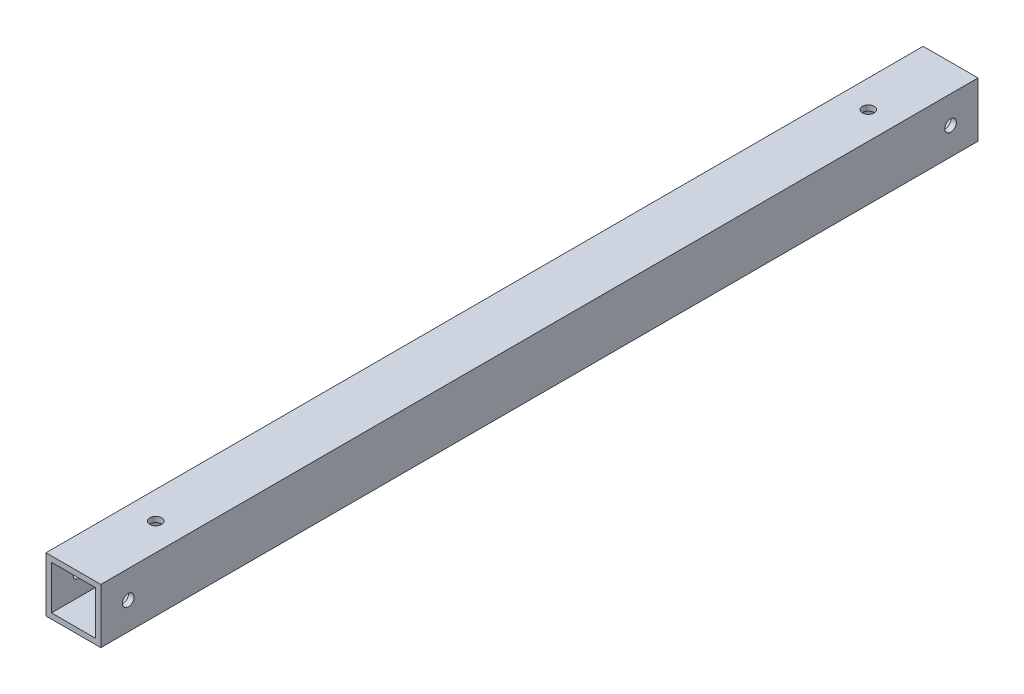
ISO-10303-21;
HEADER;
FILE_DESCRIPTION(('STEP AP214'),'2;1');
FILE_NAME('part.step','',(''),(''),'','','');
FILE_SCHEMA(('AUTOMOTIVE_DESIGN { 1 0 10303 214 1 1 1 1 }'));
ENDSEC;
DATA;
#1=APPLICATION_CONTEXT('core data for automotive mechanical design processes');
#2=APPLICATION_PROTOCOL_DEFINITION('international standard','automotive_design',2000,#1);
#3=PRODUCT_CONTEXT('',#1,'mechanical');
#4=PRODUCT('Part','Part','',(#3));
#5=PRODUCT_RELATED_PRODUCT_CATEGORY('part','',(#4));
#6=PRODUCT_DEFINITION_FORMATION('','',#4);
#7=PRODUCT_DEFINITION_CONTEXT('part definition',#1,'design');
#8=PRODUCT_DEFINITION('design','',#6,#7);
#9=PRODUCT_DEFINITION_SHAPE('','',#8);
#10=(LENGTH_UNIT() NAMED_UNIT(*) SI_UNIT(.MILLI.,.METRE.));
#11=(NAMED_UNIT(*) PLANE_ANGLE_UNIT() SI_UNIT($,.RADIAN.));
#12=(NAMED_UNIT(*) SI_UNIT($,.STERADIAN.) SOLID_ANGLE_UNIT());
#13=UNCERTAINTY_MEASURE_WITH_UNIT(LENGTH_MEASURE(1.E-05),#10,'distance_accuracy_value','');
#14=(GEOMETRIC_REPRESENTATION_CONTEXT(3) GLOBAL_UNCERTAINTY_ASSIGNED_CONTEXT((#13)) GLOBAL_UNIT_ASSIGNED_CONTEXT((#10,
#11,#12)) REPRESENTATION_CONTEXT('',''));
#15=CARTESIAN_POINT('',(0.,0.,0.));
#16=DIRECTION('',(0.,0.,1.));
#17=DIRECTION('',(1.,0.,0.));
#18=AXIS2_PLACEMENT_3D('',#15,#16,#17);
#19=CARTESIAN_POINT('',(0.,0.,240.));
#20=DIRECTION('',(0.,0.,1.));
#21=DIRECTION('',(1.,0.,0.));
#22=AXIS2_PLACEMENT_3D('',#19,#20,#21);
#23=PLANE('',#22);
#24=DIRECTION('',(0.,1.,0.));
#25=VECTOR('',#24,1.);
#26=CARTESIAN_POINT('',(7.5,7.5,240.));
#27=LINE('',#26,#25);
#28=CARTESIAN_POINT('',(7.5,-7.5,240.));
#29=VERTEX_POINT('',#28);
#30=CARTESIAN_POINT('',(7.5,7.5,240.));
#31=VERTEX_POINT('',#30);
#32=EDGE_CURVE('E157',#29,#31,#27,.T.);
#33=ORIENTED_EDGE('',*,*,#32,.T.);
#34=DIRECTION('',(-1.,0.,0.));
#35=VECTOR('',#34,1.);
#36=CARTESIAN_POINT('',(-7.5,7.5,240.));
#37=LINE('',#36,#35);
#38=CARTESIAN_POINT('',(-7.5,7.5,240.));
#39=VERTEX_POINT('',#38);
#40=EDGE_CURVE('E161',#31,#39,#37,.T.);
#41=ORIENTED_EDGE('',*,*,#40,.T.);
#42=DIRECTION('',(0.,-1.,0.));
#43=VECTOR('',#42,1.);
#44=CARTESIAN_POINT('',(-7.5,7.5,240.));
#45=LINE('',#44,#43);
#46=CARTESIAN_POINT('',(-7.5,-7.5,240.));
#47=VERTEX_POINT('',#46);
#48=EDGE_CURVE('E165',#39,#47,#45,.T.);
#49=ORIENTED_EDGE('',*,*,#48,.T.);
#50=DIRECTION('',(1.,0.,0.));
#51=VECTOR('',#50,1.);
#52=CARTESIAN_POINT('',(-7.5,-7.5,240.));
#53=LINE('',#52,#51);
#54=EDGE_CURVE('E168',#47,#29,#53,.T.);
#55=ORIENTED_EDGE('',*,*,#54,.T.);
#56=EDGE_LOOP('',(#33,#41,#49,#55));
#57=FACE_BOUND('',#56,.T.);
#58=DIRECTION('',(1.,0.,0.));
#59=VECTOR('',#58,1.);
#60=CARTESIAN_POINT('',(-6.,-6.,240.));
#61=LINE('',#60,#59);
#62=CARTESIAN_POINT('',(-6.,-6.,240.));
#63=VERTEX_POINT('',#62);
#64=CARTESIAN_POINT('',(6.,-6.,240.));
#65=VERTEX_POINT('',#64);
#66=EDGE_CURVE('E116',#63,#65,#61,.T.);
#67=ORIENTED_EDGE('',*,*,#66,.F.);
#68=DIRECTION('',(0.,-1.,0.));
#69=VECTOR('',#68,1.);
#70=CARTESIAN_POINT('',(-6.,6.,240.));
#71=LINE('',#70,#69);
#72=CARTESIAN_POINT('',(-6.,6.,240.));
#73=VERTEX_POINT('',#72);
#74=EDGE_CURVE('E107',#73,#63,#71,.T.);
#75=ORIENTED_EDGE('',*,*,#74,.F.);
#76=DIRECTION('',(-1.,0.,0.));
#77=VECTOR('',#76,1.);
#78=CARTESIAN_POINT('',(-6.,6.,240.));
#79=LINE('',#78,#77);
#80=CARTESIAN_POINT('',(6.,6.,240.));
#81=VERTEX_POINT('',#80);
#82=EDGE_CURVE('E133',#81,#73,#79,.T.);
#83=ORIENTED_EDGE('',*,*,#82,.F.);
#84=DIRECTION('',(0.,1.,0.));
#85=VECTOR('',#84,1.);
#86=CARTESIAN_POINT('',(6.,6.,240.));
#87=LINE('',#86,#85);
#88=EDGE_CURVE('E129',#65,#81,#87,.T.);
#89=ORIENTED_EDGE('',*,*,#88,.F.);
#90=EDGE_LOOP('',(#67,#75,#83,#89));
#91=FACE_BOUND('',#90,.T.);
#92=ADVANCED_FACE('F39',(#57,#91),#23,.T.);
#93=CARTESIAN_POINT('',(0.,0.,0.));
#94=DIRECTION('',(0.,0.,1.));
#95=DIRECTION('',(1.,0.,0.));
#96=AXIS2_PLACEMENT_3D('',#93,#94,#95);
#97=PLANE('',#96);
#98=DIRECTION('',(0.,1.,0.));
#99=VECTOR('',#98,1.);
#100=CARTESIAN_POINT('',(7.5,7.5,0.));
#101=LINE('',#100,#99);
#102=CARTESIAN_POINT('',(7.5,-7.5,0.));
#103=VERTEX_POINT('',#102);
#104=CARTESIAN_POINT('',(7.5,7.5,0.));
#105=VERTEX_POINT('',#104);
#106=EDGE_CURVE('E125',#103,#105,#101,.T.);
#107=ORIENTED_EDGE('',*,*,#106,.F.);
#108=DIRECTION('',(1.,0.,0.));
#109=VECTOR('',#108,1.);
#110=CARTESIAN_POINT('',(-7.5,-7.5,0.));
#111=LINE('',#110,#109);
#112=CARTESIAN_POINT('',(-7.5,-7.5,0.));
#113=VERTEX_POINT('',#112);
#114=EDGE_CURVE('E162',#113,#103,#111,.T.);
#115=ORIENTED_EDGE('',*,*,#114,.F.);
#116=DIRECTION('',(0.,-1.,0.));
#117=VECTOR('',#116,1.);
#118=CARTESIAN_POINT('',(-7.5,7.5,0.));
#119=LINE('',#118,#117);
#120=CARTESIAN_POINT('',(-7.5,7.5,0.));
#121=VERTEX_POINT('',#120);
#122=EDGE_CURVE('E178',#121,#113,#119,.T.);
#123=ORIENTED_EDGE('',*,*,#122,.F.);
#124=DIRECTION('',(-1.,0.,0.));
#125=VECTOR('',#124,1.);
#126=CARTESIAN_POINT('',(-7.5,7.5,0.));
#127=LINE('',#126,#125);
#128=EDGE_CURVE('E175',#105,#121,#127,.T.);
#129=ORIENTED_EDGE('',*,*,#128,.F.);
#130=EDGE_LOOP('',(#107,#115,#123,#129));
#131=FACE_BOUND('',#130,.T.);
#132=DIRECTION('',(0.,-1.,0.));
#133=VECTOR('',#132,1.);
#134=CARTESIAN_POINT('',(-6.,6.,0.));
#135=LINE('',#134,#133);
#136=CARTESIAN_POINT('',(-6.,6.,0.));
#137=VERTEX_POINT('',#136);
#138=CARTESIAN_POINT('',(-6.,-6.,0.));
#139=VERTEX_POINT('',#138);
#140=EDGE_CURVE('E65',#137,#139,#135,.T.);
#141=ORIENTED_EDGE('',*,*,#140,.T.);
#142=DIRECTION('',(1.,0.,0.));
#143=VECTOR('',#142,1.);
#144=CARTESIAN_POINT('',(-6.,-6.,0.));
#145=LINE('',#144,#143);
#146=CARTESIAN_POINT('',(6.,-6.,0.));
#147=VERTEX_POINT('',#146);
#148=EDGE_CURVE('E123',#139,#147,#145,.T.);
#149=ORIENTED_EDGE('',*,*,#148,.T.);
#150=DIRECTION('',(0.,1.,0.));
#151=VECTOR('',#150,1.);
#152=CARTESIAN_POINT('',(6.,6.,0.));
#153=LINE('',#152,#151);
#154=CARTESIAN_POINT('',(6.,6.,0.));
#155=VERTEX_POINT('',#154);
#156=EDGE_CURVE('E144',#147,#155,#153,.T.);
#157=ORIENTED_EDGE('',*,*,#156,.T.);
#158=DIRECTION('',(-1.,0.,0.));
#159=VECTOR('',#158,1.);
#160=CARTESIAN_POINT('',(-6.,6.,0.));
#161=LINE('',#160,#159);
#162=EDGE_CURVE('E117',#155,#137,#161,.T.);
#163=ORIENTED_EDGE('',*,*,#162,.T.);
#164=EDGE_LOOP('',(#141,#149,#157,#163));
#165=FACE_BOUND('',#164,.T.);
#166=ADVANCED_FACE('F288',(#131,#165),#97,.F.);
#167=CARTESIAN_POINT('',(7.5,7.5,240.));
#168=DIRECTION('',(-1.,0.,0.));
#169=DIRECTION('',(0.,0.,1.));
#170=AXIS2_PLACEMENT_3D('',#167,#168,#169);
#171=PLANE('',#170);
#172=CARTESIAN_POINT('',(7.5,0.,232.5));
#173=DIRECTION('',(1.,0.,0.));
#174=DIRECTION('',(0.,0.,-1.));
#175=AXIS2_PLACEMENT_3D('',#172,#173,#174);
#176=CIRCLE('',#175,1.59999999999999);
#177=CARTESIAN_POINT('',(7.5,0.,230.9));
#178=VERTEX_POINT('',#177);
#179=EDGE_CURVE('E214',#178,#178,#176,.T.);
#180=ORIENTED_EDGE('',*,*,#179,.F.);
#181=EDGE_LOOP('',(#180));
#182=FACE_BOUND('',#181,.T.);
#183=CARTESIAN_POINT('',(7.5,0.,7.5));
#184=DIRECTION('',(1.,0.,0.));
#185=DIRECTION('',(0.,0.,-1.));
#186=AXIS2_PLACEMENT_3D('',#183,#184,#185);
#187=CIRCLE('',#186,1.6);
#188=CARTESIAN_POINT('',(7.5,0.,5.9));
#189=VERTEX_POINT('',#188);
#190=EDGE_CURVE('E226',#189,#189,#187,.T.);
#191=ORIENTED_EDGE('',*,*,#190,.F.);
#192=EDGE_LOOP('',(#191));
#193=FACE_BOUND('',#192,.T.);
#194=ORIENTED_EDGE('',*,*,#106,.T.);
#195=DIRECTION('',(0.,0.,-1.));
#196=VECTOR('',#195,1.);
#197=CARTESIAN_POINT('',(7.5,7.5,240.));
#198=LINE('',#197,#196);
#199=EDGE_CURVE('E11',#31,#105,#198,.T.);
#200=ORIENTED_EDGE('',*,*,#199,.F.);
#201=ORIENTED_EDGE('',*,*,#32,.F.);
#202=DIRECTION('',(0.,0.,-1.));
#203=VECTOR('',#202,1.);
#204=CARTESIAN_POINT('',(7.5,-7.5,240.));
#205=LINE('',#204,#203);
#206=EDGE_CURVE('E171',#29,#103,#205,.T.);
#207=ORIENTED_EDGE('',*,*,#206,.T.);
#208=EDGE_LOOP('',(#194,#200,#201,#207));
#209=FACE_BOUND('',#208,.T.);
#210=ADVANCED_FACE('F41',(#182,#193,#209),#171,.F.);
#211=CARTESIAN_POINT('',(-7.5,7.5,240.));
#212=DIRECTION('',(0.,-1.,0.));
#213=DIRECTION('',(0.,0.,-1.));
#214=AXIS2_PLACEMENT_3D('',#211,#212,#213);
#215=PLANE('',#214);
#216=CARTESIAN_POINT('',(0.,7.5,22.5));
#217=DIRECTION('',(0.,1.,0.));
#218=DIRECTION('',(0.,0.,1.));
#219=AXIS2_PLACEMENT_3D('',#216,#217,#218);
#220=CIRCLE('',#219,1.6);
#221=CARTESIAN_POINT('',(0.,7.5,24.1));
#222=VERTEX_POINT('',#221);
#223=EDGE_CURVE('E238',#222,#222,#220,.T.);
#224=ORIENTED_EDGE('',*,*,#223,.F.);
#225=EDGE_LOOP('',(#224));
#226=FACE_BOUND('',#225,.T.);
#227=CARTESIAN_POINT('',(0.,7.5,217.5));
#228=DIRECTION('',(0.,1.,0.));
#229=DIRECTION('',(0.,0.,1.));
#230=AXIS2_PLACEMENT_3D('',#227,#228,#229);
#231=CIRCLE('',#230,1.59999999999998);
#232=CARTESIAN_POINT('',(0.,7.5,219.1));
#233=VERTEX_POINT('',#232);
#234=EDGE_CURVE('E234',#233,#233,#231,.T.);
#235=ORIENTED_EDGE('',*,*,#234,.F.);
#236=EDGE_LOOP('',(#235));
#237=FACE_BOUND('',#236,.T.);
#238=ORIENTED_EDGE('',*,*,#128,.T.);
#239=DIRECTION('',(0.,0.,-1.));
#240=VECTOR('',#239,1.);
#241=CARTESIAN_POINT('',(-7.5,7.5,240.));
#242=LINE('',#241,#240);
#243=EDGE_CURVE('E49',#39,#121,#242,.T.);
#244=ORIENTED_EDGE('',*,*,#243,.F.);
#245=ORIENTED_EDGE('',*,*,#40,.F.);
#246=ORIENTED_EDGE('',*,*,#199,.T.);
#247=EDGE_LOOP('',(#238,#244,#245,#246));
#248=FACE_BOUND('',#247,.T.);
#249=ADVANCED_FACE('F292',(#226,#237,#248),#215,.F.);
#250=CARTESIAN_POINT('',(-7.5,7.5,240.));
#251=DIRECTION('',(1.,0.,0.));
#252=DIRECTION('',(0.,0.,-1.));
#253=AXIS2_PLACEMENT_3D('',#250,#251,#252);
#254=PLANE('',#253);
#255=CARTESIAN_POINT('',(-7.5,0.,232.5));
#256=DIRECTION('',(1.,0.,0.));
#257=DIRECTION('',(0.,0.,-1.));
#258=AXIS2_PLACEMENT_3D('',#255,#256,#257);
#259=CIRCLE('',#258,1.59999999999999);
#260=CARTESIAN_POINT('',(-7.5,0.,230.9));
#261=VERTEX_POINT('',#260);
#262=EDGE_CURVE('E206',#261,#261,#259,.T.);
#263=ORIENTED_EDGE('',*,*,#262,.T.);
#264=EDGE_LOOP('',(#263));
#265=FACE_BOUND('',#264,.T.);
#266=CARTESIAN_POINT('',(-7.5,0.,7.5));
#267=DIRECTION('',(1.,0.,0.));
#268=DIRECTION('',(0.,0.,-1.));
#269=AXIS2_PLACEMENT_3D('',#266,#267,#268);
#270=CIRCLE('',#269,1.6);
#271=CARTESIAN_POINT('',(-7.5,0.,5.9));
#272=VERTEX_POINT('',#271);
#273=EDGE_CURVE('E220',#272,#272,#270,.T.);
#274=ORIENTED_EDGE('',*,*,#273,.T.);
#275=EDGE_LOOP('',(#274));
#276=FACE_BOUND('',#275,.T.);
#277=ORIENTED_EDGE('',*,*,#122,.T.);
#278=DIRECTION('',(0.,0.,-1.));
#279=VECTOR('',#278,1.);
#280=CARTESIAN_POINT('',(-7.5,-7.5,240.));
#281=LINE('',#280,#279);
#282=EDGE_CURVE('E186',#47,#113,#281,.T.);
#283=ORIENTED_EDGE('',*,*,#282,.F.);
#284=ORIENTED_EDGE('',*,*,#48,.F.);
#285=ORIENTED_EDGE('',*,*,#243,.T.);
#286=EDGE_LOOP('',(#277,#283,#284,#285));
#287=FACE_BOUND('',#286,.T.);
#288=ADVANCED_FACE('F275',(#265,#276,#287),#254,.F.);
#289=CARTESIAN_POINT('',(-7.5,-7.5,240.));
#290=DIRECTION('',(0.,1.,0.));
#291=DIRECTION('',(0.,0.,1.));
#292=AXIS2_PLACEMENT_3D('',#289,#290,#291);
#293=PLANE('',#292);
#294=CARTESIAN_POINT('',(0.,-7.5,22.5));
#295=DIRECTION('',(0.,1.,0.));
#296=DIRECTION('',(0.,0.,1.));
#297=AXIS2_PLACEMENT_3D('',#294,#295,#296);
#298=CIRCLE('',#297,1.6);
#299=CARTESIAN_POINT('',(0.,-7.5,24.1));
#300=VERTEX_POINT('',#299);
#301=EDGE_CURVE('E198',#300,#300,#298,.T.);
#302=ORIENTED_EDGE('',*,*,#301,.T.);
#303=EDGE_LOOP('',(#302));
#304=FACE_BOUND('',#303,.T.);
#305=CARTESIAN_POINT('',(0.,-7.5,217.5));
#306=DIRECTION('',(0.,1.,0.));
#307=DIRECTION('',(0.,0.,1.));
#308=AXIS2_PLACEMENT_3D('',#305,#306,#307);
#309=CIRCLE('',#308,1.59999999999998);
#310=CARTESIAN_POINT('',(0.,-7.5,219.1));
#311=VERTEX_POINT('',#310);
#312=EDGE_CURVE('E242',#311,#311,#309,.T.);
#313=ORIENTED_EDGE('',*,*,#312,.T.);
#314=EDGE_LOOP('',(#313));
#315=FACE_BOUND('',#314,.T.);
#316=ORIENTED_EDGE('',*,*,#114,.T.);
#317=ORIENTED_EDGE('',*,*,#206,.F.);
#318=ORIENTED_EDGE('',*,*,#54,.F.);
#319=ORIENTED_EDGE('',*,*,#282,.T.);
#320=EDGE_LOOP('',(#316,#317,#318,#319));
#321=FACE_BOUND('',#320,.T.);
#322=ADVANCED_FACE('F272',(#304,#315,#321),#293,.F.);
#323=CARTESIAN_POINT('',(-6.,6.,240.));
#324=DIRECTION('',(1.,0.,0.));
#325=DIRECTION('',(0.,1.,0.));
#326=AXIS2_PLACEMENT_3D('',#323,#324,#325);
#327=PLANE('',#326);
#328=CARTESIAN_POINT('',(-6.,0.,232.5));
#329=DIRECTION('',(1.,0.,0.));
#330=DIRECTION('',(0.,1.,0.));
#331=AXIS2_PLACEMENT_3D('',#328,#329,#330);
#332=CIRCLE('',#331,1.59999999999999);
#333=CARTESIAN_POINT('',(-6.,0.,230.9));
#334=VERTEX_POINT('',#333);
#335=EDGE_CURVE('E230',#334,#334,#332,.T.);
#336=ORIENTED_EDGE('',*,*,#335,.F.);
#337=EDGE_LOOP('',(#336));
#338=FACE_BOUND('',#337,.T.);
#339=CARTESIAN_POINT('',(-6.,0.,7.5));
#340=DIRECTION('',(1.,0.,0.));
#341=DIRECTION('',(0.,1.,0.));
#342=AXIS2_PLACEMENT_3D('',#339,#340,#341);
#343=CIRCLE('',#342,1.6);
#344=CARTESIAN_POINT('',(-6.,0.,5.9));
#345=VERTEX_POINT('',#344);
#346=EDGE_CURVE('E205',#345,#345,#343,.T.);
#347=ORIENTED_EDGE('',*,*,#346,.F.);
#348=EDGE_LOOP('',(#347));
#349=FACE_BOUND('',#348,.T.);
#350=ORIENTED_EDGE('',*,*,#140,.F.);
#351=DIRECTION('',(0.,0.,-1.));
#352=VECTOR('',#351,1.);
#353=CARTESIAN_POINT('',(-6.,6.,240.));
#354=LINE('',#353,#352);
#355=EDGE_CURVE('E111',#73,#137,#354,.T.);
#356=ORIENTED_EDGE('',*,*,#355,.F.);
#357=ORIENTED_EDGE('',*,*,#74,.T.);
#358=DIRECTION('',(0.,0.,-1.));
#359=VECTOR('',#358,1.);
#360=CARTESIAN_POINT('',(-6.,-6.,240.));
#361=LINE('',#360,#359);
#362=EDGE_CURVE('E110',#63,#139,#361,.T.);
#363=ORIENTED_EDGE('',*,*,#362,.T.);
#364=EDGE_LOOP('',(#350,#356,#357,#363));
#365=FACE_BOUND('',#364,.T.);
#366=ADVANCED_FACE('F109',(#338,#349,#365),#327,.T.);
#367=CARTESIAN_POINT('',(-6.,-6.,240.));
#368=DIRECTION('',(0.,1.,0.));
#369=DIRECTION('',(0.,0.,1.));
#370=AXIS2_PLACEMENT_3D('',#367,#368,#369);
#371=PLANE('',#370);
#372=CARTESIAN_POINT('',(0.,-6.,22.5));
#373=DIRECTION('',(0.,1.,0.));
#374=DIRECTION('',(0.,0.,1.));
#375=AXIS2_PLACEMENT_3D('',#372,#373,#374);
#376=CIRCLE('',#375,1.6);
#377=CARTESIAN_POINT('',(0.,-6.,24.1));
#378=VERTEX_POINT('',#377);
#379=EDGE_CURVE('E141',#378,#378,#376,.T.);
#380=ORIENTED_EDGE('',*,*,#379,.F.);
#381=EDGE_LOOP('',(#380));
#382=FACE_BOUND('',#381,.T.);
#383=CARTESIAN_POINT('',(0.,-6.,217.5));
#384=DIRECTION('',(0.,1.,0.));
#385=DIRECTION('',(0.,0.,1.));
#386=AXIS2_PLACEMENT_3D('',#383,#384,#385);
#387=CIRCLE('',#386,1.59999999999998);
#388=CARTESIAN_POINT('',(0.,-6.,219.1));
#389=VERTEX_POINT('',#388);
#390=EDGE_CURVE('E197',#389,#389,#387,.T.);
#391=ORIENTED_EDGE('',*,*,#390,.F.);
#392=EDGE_LOOP('',(#391));
#393=FACE_BOUND('',#392,.T.);
#394=ORIENTED_EDGE('',*,*,#148,.F.);
#395=ORIENTED_EDGE('',*,*,#362,.F.);
#396=ORIENTED_EDGE('',*,*,#66,.T.);
#397=DIRECTION('',(0.,0.,-1.));
#398=VECTOR('',#397,1.);
#399=CARTESIAN_POINT('',(6.,-6.,240.));
#400=LINE('',#399,#398);
#401=EDGE_CURVE('E126',#65,#147,#400,.T.);
#402=ORIENTED_EDGE('',*,*,#401,.T.);
#403=EDGE_LOOP('',(#394,#395,#396,#402));
#404=FACE_BOUND('',#403,.T.);
#405=ADVANCED_FACE('F120',(#382,#393,#404),#371,.T.);
#406=CARTESIAN_POINT('',(6.,6.,240.));
#407=DIRECTION('',(-1.,0.,0.));
#408=DIRECTION('',(0.,-1.,0.));
#409=AXIS2_PLACEMENT_3D('',#406,#407,#408);
#410=PLANE('',#409);
#411=CARTESIAN_POINT('',(6.,0.,232.5));
#412=DIRECTION('',(-1.,0.,0.));
#413=DIRECTION('',(0.,-1.,0.));
#414=AXIS2_PLACEMENT_3D('',#411,#412,#413);
#415=CIRCLE('',#414,1.59999999999999);
#416=CARTESIAN_POINT('',(6.,0.,230.9));
#417=VERTEX_POINT('',#416);
#418=EDGE_CURVE('E43',#417,#417,#415,.T.);
#419=ORIENTED_EDGE('',*,*,#418,.F.);
#420=EDGE_LOOP('',(#419));
#421=FACE_BOUND('',#420,.T.);
#422=CARTESIAN_POINT('',(6.,0.,7.5));
#423=DIRECTION('',(-1.,0.,0.));
#424=DIRECTION('',(0.,-1.,0.));
#425=AXIS2_PLACEMENT_3D('',#422,#423,#424);
#426=CIRCLE('',#425,1.6);
#427=CARTESIAN_POINT('',(6.,0.,5.9));
#428=VERTEX_POINT('',#427);
#429=EDGE_CURVE('E202',#428,#428,#426,.T.);
#430=ORIENTED_EDGE('',*,*,#429,.F.);
#431=EDGE_LOOP('',(#430));
#432=FACE_BOUND('',#431,.T.);
#433=ORIENTED_EDGE('',*,*,#156,.F.);
#434=ORIENTED_EDGE('',*,*,#401,.F.);
#435=ORIENTED_EDGE('',*,*,#88,.T.);
#436=DIRECTION('',(0.,0.,-1.));
#437=VECTOR('',#436,1.);
#438=CARTESIAN_POINT('',(6.,6.,240.));
#439=LINE('',#438,#437);
#440=EDGE_CURVE('E57',#81,#155,#439,.T.);
#441=ORIENTED_EDGE('',*,*,#440,.T.);
#442=EDGE_LOOP('',(#433,#434,#435,#441));
#443=FACE_BOUND('',#442,.T.);
#444=ADVANCED_FACE('F260',(#421,#432,#443),#410,.T.);
#445=CARTESIAN_POINT('',(-6.,6.,240.));
#446=DIRECTION('',(0.,-1.,0.));
#447=DIRECTION('',(0.,0.,-1.));
#448=AXIS2_PLACEMENT_3D('',#445,#446,#447);
#449=PLANE('',#448);
#450=CARTESIAN_POINT('',(0.,6.,22.5));
#451=DIRECTION('',(0.,-1.,0.));
#452=DIRECTION('',(0.,0.,-1.));
#453=AXIS2_PLACEMENT_3D('',#450,#451,#452);
#454=CIRCLE('',#453,1.6);
#455=CARTESIAN_POINT('',(0.,6.,20.9));
#456=VERTEX_POINT('',#455);
#457=EDGE_CURVE('E199',#456,#456,#454,.T.);
#458=ORIENTED_EDGE('',*,*,#457,.F.);
#459=EDGE_LOOP('',(#458));
#460=FACE_BOUND('',#459,.T.);
#461=CARTESIAN_POINT('',(0.,6.,217.5));
#462=DIRECTION('',(0.,-1.,0.));
#463=DIRECTION('',(0.,0.,-1.));
#464=AXIS2_PLACEMENT_3D('',#461,#462,#463);
#465=CIRCLE('',#464,1.59999999999998);
#466=CARTESIAN_POINT('',(0.,6.,215.9));
#467=VERTEX_POINT('',#466);
#468=EDGE_CURVE('E193',#467,#467,#465,.T.);
#469=ORIENTED_EDGE('',*,*,#468,.F.);
#470=EDGE_LOOP('',(#469));
#471=FACE_BOUND('',#470,.T.);
#472=ORIENTED_EDGE('',*,*,#162,.F.);
#473=ORIENTED_EDGE('',*,*,#440,.F.);
#474=ORIENTED_EDGE('',*,*,#82,.T.);
#475=ORIENTED_EDGE('',*,*,#355,.T.);
#476=EDGE_LOOP('',(#472,#473,#474,#475));
#477=FACE_BOUND('',#476,.T.);
#478=ADVANCED_FACE('F315',(#460,#471,#477),#449,.T.);
#479=CARTESIAN_POINT('',(0.,-7.5,217.5));
#480=DIRECTION('',(0.,1.,0.));
#481=DIRECTION('',(0.,0.,1.));
#482=AXIS2_PLACEMENT_3D('',#479,#480,#481);
#483=CYLINDRICAL_SURFACE('',#482,1.59999999999998);
#484=ORIENTED_EDGE('',*,*,#468,.T.);
#485=EDGE_LOOP('',(#484));
#486=FACE_BOUND('',#485,.T.);
#487=ORIENTED_EDGE('',*,*,#234,.T.);
#488=EDGE_LOOP('',(#487));
#489=FACE_BOUND('',#488,.T.);
#490=ADVANCED_FACE('F269',(#486,#489),#483,.F.);
#491=CARTESIAN_POINT('',(0.,-7.5,22.5));
#492=DIRECTION('',(0.,1.,0.));
#493=DIRECTION('',(0.,0.,1.));
#494=AXIS2_PLACEMENT_3D('',#491,#492,#493);
#495=CYLINDRICAL_SURFACE('',#494,1.6);
#496=ORIENTED_EDGE('',*,*,#457,.T.);
#497=EDGE_LOOP('',(#496));
#498=FACE_BOUND('',#497,.T.);
#499=ORIENTED_EDGE('',*,*,#223,.T.);
#500=EDGE_LOOP('',(#499));
#501=FACE_BOUND('',#500,.T.);
#502=ADVANCED_FACE('F267',(#498,#501),#495,.F.);
#503=ORIENTED_EDGE('',*,*,#390,.T.);
#504=EDGE_LOOP('',(#503));
#505=FACE_BOUND('',#504,.T.);
#506=ORIENTED_EDGE('',*,*,#312,.F.);
#507=EDGE_LOOP('',(#506));
#508=FACE_BOUND('',#507,.T.);
#509=ADVANCED_FACE('F264',(#505,#508),#483,.F.);
#510=ORIENTED_EDGE('',*,*,#379,.T.);
#511=EDGE_LOOP('',(#510));
#512=FACE_BOUND('',#511,.T.);
#513=ORIENTED_EDGE('',*,*,#301,.F.);
#514=EDGE_LOOP('',(#513));
#515=FACE_BOUND('',#514,.T.);
#516=ADVANCED_FACE('F255',(#512,#515),#495,.F.);
#517=CARTESIAN_POINT('',(-7.5,0.,7.5));
#518=DIRECTION('',(1.,0.,0.));
#519=DIRECTION('',(0.,0.,-1.));
#520=AXIS2_PLACEMENT_3D('',#517,#518,#519);
#521=CYLINDRICAL_SURFACE('',#520,1.6);
#522=CARTESIAN_POINT('',(6.,0.,5.9));
#523=CARTESIAN_POINT('',(6.015625,0.,5.9));
#524=CARTESIAN_POINT('',(6.03125,0.,5.9));
#525=CARTESIAN_POINT('',(6.0625,0.,5.9));
#526=CARTESIAN_POINT('',(6.078125,0.,5.9));
#527=CARTESIAN_POINT('',(6.109375,0.,5.9));
#528=CARTESIAN_POINT('',(6.125,0.,5.9));
#529=CARTESIAN_POINT('',(6.15625,0.,5.9));
#530=CARTESIAN_POINT('',(6.171875,0.,5.9));
#531=CARTESIAN_POINT('',(6.203125,0.,5.9));
#532=CARTESIAN_POINT('',(6.21875,0.,5.9));
#533=CARTESIAN_POINT('',(6.25,0.,5.9));
#534=CARTESIAN_POINT('',(6.265625,0.,5.9));
#535=CARTESIAN_POINT('',(6.296875,0.,5.9));
#536=CARTESIAN_POINT('',(6.3125,0.,5.9));
#537=CARTESIAN_POINT('',(6.34375,0.,5.9));
#538=CARTESIAN_POINT('',(6.359375,0.,5.9));
#539=CARTESIAN_POINT('',(6.390625,0.,5.9));
#540=CARTESIAN_POINT('',(6.40625,0.,5.9));
#541=CARTESIAN_POINT('',(6.4375,0.,5.9));
#542=CARTESIAN_POINT('',(6.453125,0.,5.9));
#543=CARTESIAN_POINT('',(6.484375,0.,5.9));
#544=CARTESIAN_POINT('',(6.5,0.,5.9));
#545=CARTESIAN_POINT('',(6.53125,0.,5.9));
#546=CARTESIAN_POINT('',(6.546875,0.,5.9));
#547=CARTESIAN_POINT('',(6.578125,0.,5.9));
#548=CARTESIAN_POINT('',(6.59375,0.,5.9));
#549=CARTESIAN_POINT('',(6.625,0.,5.9));
#550=CARTESIAN_POINT('',(6.640625,0.,5.9));
#551=CARTESIAN_POINT('',(6.671875,0.,5.9));
#552=CARTESIAN_POINT('',(6.6875,0.,5.9));
#553=CARTESIAN_POINT('',(6.71875,0.,5.9));
#554=CARTESIAN_POINT('',(6.734375,0.,5.9));
#555=CARTESIAN_POINT('',(6.765625,0.,5.9));
#556=CARTESIAN_POINT('',(6.78125,0.,5.9));
#557=CARTESIAN_POINT('',(6.8125,0.,5.9));
#558=CARTESIAN_POINT('',(6.828125,0.,5.9));
#559=CARTESIAN_POINT('',(6.859375,0.,5.9));
#560=CARTESIAN_POINT('',(6.875,0.,5.9));
#561=CARTESIAN_POINT('',(6.90625,0.,5.9));
#562=CARTESIAN_POINT('',(6.921875,0.,5.9));
#563=CARTESIAN_POINT('',(6.953125,0.,5.9));
#564=CARTESIAN_POINT('',(6.96875,0.,5.9));
#565=CARTESIAN_POINT('',(7.,0.,5.9));
#566=CARTESIAN_POINT('',(7.015625,0.,5.9));
#567=CARTESIAN_POINT('',(7.046875,0.,5.9));
#568=CARTESIAN_POINT('',(7.0625,0.,5.9));
#569=CARTESIAN_POINT('',(7.09375,0.,5.9));
#570=CARTESIAN_POINT('',(7.109375,0.,5.9));
#571=CARTESIAN_POINT('',(7.140625,0.,5.9));
#572=CARTESIAN_POINT('',(7.15625,0.,5.9));
#573=CARTESIAN_POINT('',(7.1875,0.,5.9));
#574=CARTESIAN_POINT('',(7.203125,0.,5.9));
#575=CARTESIAN_POINT('',(7.234375,0.,5.9));
#576=CARTESIAN_POINT('',(7.25,0.,5.9));
#577=CARTESIAN_POINT('',(7.28125,0.,5.9));
#578=CARTESIAN_POINT('',(7.296875,0.,5.9));
#579=CARTESIAN_POINT('',(7.328125,0.,5.9));
#580=CARTESIAN_POINT('',(7.34375,0.,5.9));
#581=CARTESIAN_POINT('',(7.375,0.,5.9));
#582=CARTESIAN_POINT('',(7.390625,0.,5.9));
#583=CARTESIAN_POINT('',(7.421875,0.,5.9));
#584=CARTESIAN_POINT('',(7.4375,0.,5.9));
#585=CARTESIAN_POINT('',(7.46875,0.,5.9));
#586=CARTESIAN_POINT('',(7.484375,0.,5.9));
#587=CARTESIAN_POINT('',(7.5,0.,5.9));
#588=B_SPLINE_CURVE_WITH_KNOTS('',3,(#522,#523,#524,#525,#526,#527,#528,#529,#530,#531,#532,
#533,#534,#535,#536,#537,#538,#539,#540,#541,#542,#543,#544,#545,#546,#547,#548,#549,#550,#551,
#552,#553,#554,#555,#556,#557,#558,#559,#560,#561,#562,#563,#564,#565,#566,#567,#568,#569,#570,
#571,#572,#573,#574,#575,#576,#577,#578,#579,#580,#581,#582,#583,#584,#585,#586,#587),
.UNSPECIFIED.,.F.,.F.,(4,2,2,2,2,2,2,2,2,2,2,2,2,2,2,2,2,2,2,2,2,2,2,2,2,2,2,2,2,2,2,2,4),(0.,
0.046875,0.0937500000000001,0.140625,0.1875,0.234375,0.28125,0.328125,0.375,0.421874999999999,
0.468749999999999,0.515624999999999,0.562499999999999,0.609374999999999,0.656249999999999,
0.703124999999999,0.749999999999999,0.796874999999999,0.843749999999999,0.890624999999999,
0.937499999999999,0.984374999999999,1.03125,1.078125,1.125,1.171875,1.21875,1.265625,1.3125,
1.359375,1.40625,1.453125,1.5),.UNSPECIFIED.);
#589=EDGE_CURVE('BSEAM325',#428,#189,#588,.T.);
#590=ORIENTED_EDGE('',*,*,#429,.T.);
#591=ORIENTED_EDGE('',*,*,#190,.T.);
#592=ORIENTED_EDGE('',*,*,#589,.T.);
#593=ORIENTED_EDGE('',*,*,#589,.F.);
#594=EDGE_LOOP('',(#590,#592,#591,#593));
#595=FACE_BOUND('',#594,.T.);
#596=ADVANCED_FACE('F325',(#595),#521,.F.);
#597=CARTESIAN_POINT('',(-7.5,0.,232.5));
#598=DIRECTION('',(1.,0.,0.));
#599=DIRECTION('',(0.,0.,-1.));
#600=AXIS2_PLACEMENT_3D('',#597,#598,#599);
#601=CYLINDRICAL_SURFACE('',#600,1.59999999999999);
#602=CARTESIAN_POINT('',(6.,0.,230.9));
#603=CARTESIAN_POINT('',(6.015625,0.,230.9));
#604=CARTESIAN_POINT('',(6.03125,0.,230.9));
#605=CARTESIAN_POINT('',(6.0625,0.,230.9));
#606=CARTESIAN_POINT('',(6.078125,0.,230.9));
#607=CARTESIAN_POINT('',(6.109375,0.,230.9));
#608=CARTESIAN_POINT('',(6.125,0.,230.9));
#609=CARTESIAN_POINT('',(6.15625,0.,230.9));
#610=CARTESIAN_POINT('',(6.171875,0.,230.9));
#611=CARTESIAN_POINT('',(6.203125,0.,230.9));
#612=CARTESIAN_POINT('',(6.21875,0.,230.9));
#613=CARTESIAN_POINT('',(6.25,0.,230.9));
#614=CARTESIAN_POINT('',(6.265625,0.,230.9));
#615=CARTESIAN_POINT('',(6.296875,0.,230.9));
#616=CARTESIAN_POINT('',(6.3125,0.,230.9));
#617=CARTESIAN_POINT('',(6.34375,0.,230.9));
#618=CARTESIAN_POINT('',(6.359375,0.,230.9));
#619=CARTESIAN_POINT('',(6.390625,0.,230.9));
#620=CARTESIAN_POINT('',(6.40625,0.,230.9));
#621=CARTESIAN_POINT('',(6.4375,0.,230.9));
#622=CARTESIAN_POINT('',(6.453125,0.,230.9));
#623=CARTESIAN_POINT('',(6.484375,0.,230.9));
#624=CARTESIAN_POINT('',(6.5,0.,230.9));
#625=CARTESIAN_POINT('',(6.53125,0.,230.9));
#626=CARTESIAN_POINT('',(6.546875,0.,230.9));
#627=CARTESIAN_POINT('',(6.578125,0.,230.9));
#628=CARTESIAN_POINT('',(6.59375,0.,230.9));
#629=CARTESIAN_POINT('',(6.625,0.,230.9));
#630=CARTESIAN_POINT('',(6.640625,0.,230.9));
#631=CARTESIAN_POINT('',(6.671875,0.,230.9));
#632=CARTESIAN_POINT('',(6.6875,0.,230.9));
#633=CARTESIAN_POINT('',(6.71875,0.,230.9));
#634=CARTESIAN_POINT('',(6.734375,0.,230.9));
#635=CARTESIAN_POINT('',(6.765625,0.,230.9));
#636=CARTESIAN_POINT('',(6.78125,0.,230.9));
#637=CARTESIAN_POINT('',(6.8125,0.,230.9));
#638=CARTESIAN_POINT('',(6.828125,0.,230.9));
#639=CARTESIAN_POINT('',(6.859375,0.,230.9));
#640=CARTESIAN_POINT('',(6.875,0.,230.9));
#641=CARTESIAN_POINT('',(6.90625,0.,230.9));
#642=CARTESIAN_POINT('',(6.921875,0.,230.9));
#643=CARTESIAN_POINT('',(6.953125,0.,230.9));
#644=CARTESIAN_POINT('',(6.96875,0.,230.9));
#645=CARTESIAN_POINT('',(7.,0.,230.9));
#646=CARTESIAN_POINT('',(7.015625,0.,230.9));
#647=CARTESIAN_POINT('',(7.046875,0.,230.9));
#648=CARTESIAN_POINT('',(7.0625,0.,230.9));
#649=CARTESIAN_POINT('',(7.09375,0.,230.9));
#650=CARTESIAN_POINT('',(7.109375,0.,230.9));
#651=CARTESIAN_POINT('',(7.140625,0.,230.9));
#652=CARTESIAN_POINT('',(7.15625,0.,230.9));
#653=CARTESIAN_POINT('',(7.1875,0.,230.9));
#654=CARTESIAN_POINT('',(7.203125,0.,230.9));
#655=CARTESIAN_POINT('',(7.234375,0.,230.9));
#656=CARTESIAN_POINT('',(7.25,0.,230.9));
#657=CARTESIAN_POINT('',(7.28125,0.,230.9));
#658=CARTESIAN_POINT('',(7.296875,0.,230.9));
#659=CARTESIAN_POINT('',(7.328125,0.,230.9));
#660=CARTESIAN_POINT('',(7.34375,0.,230.9));
#661=CARTESIAN_POINT('',(7.375,0.,230.9));
#662=CARTESIAN_POINT('',(7.390625,0.,230.9));
#663=CARTESIAN_POINT('',(7.421875,0.,230.9));
#664=CARTESIAN_POINT('',(7.4375,0.,230.9));
#665=CARTESIAN_POINT('',(7.46875,0.,230.9));
#666=CARTESIAN_POINT('',(7.484375,0.,230.9));
#667=CARTESIAN_POINT('',(7.5,0.,230.9));
#668=B_SPLINE_CURVE_WITH_KNOTS('',3,(#602,#603,#604,#605,#606,#607,#608,#609,#610,#611,#612,
#613,#614,#615,#616,#617,#618,#619,#620,#621,#622,#623,#624,#625,#626,#627,#628,#629,#630,#631,
#632,#633,#634,#635,#636,#637,#638,#639,#640,#641,#642,#643,#644,#645,#646,#647,#648,#649,#650,
#651,#652,#653,#654,#655,#656,#657,#658,#659,#660,#661,#662,#663,#664,#665,#666,#667),
.UNSPECIFIED.,.F.,.F.,(4,2,2,2,2,2,2,2,2,2,2,2,2,2,2,2,2,2,2,2,2,2,2,2,2,2,2,2,2,2,2,2,4),(0.,
0.046875,0.0937500000000001,0.140625,0.1875,0.234375,0.28125,0.328125,0.375,0.421874999999999,
0.468749999999999,0.515624999999999,0.562499999999999,0.609374999999999,0.656249999999999,
0.703124999999999,0.749999999999999,0.796874999999999,0.843749999999999,0.890624999999999,
0.937499999999999,0.984374999999999,1.03125,1.078125,1.125,1.171875,1.21875,1.265625,1.3125,
1.359375,1.40625,1.453125,1.5),.UNSPECIFIED.);
#669=EDGE_CURVE('BSEAM328',#417,#178,#668,.T.);
#670=ORIENTED_EDGE('',*,*,#418,.T.);
#671=ORIENTED_EDGE('',*,*,#179,.T.);
#672=ORIENTED_EDGE('',*,*,#669,.T.);
#673=ORIENTED_EDGE('',*,*,#669,.F.);
#674=EDGE_LOOP('',(#670,#672,#671,#673));
#675=FACE_BOUND('',#674,.T.);
#676=ADVANCED_FACE('F328',(#675),#601,.F.);
#677=CARTESIAN_POINT('',(-6.,0.,5.9));
#678=CARTESIAN_POINT('',(-6.015625,0.,5.9));
#679=CARTESIAN_POINT('',(-6.03125,0.,5.9));
#680=CARTESIAN_POINT('',(-6.0625,0.,5.9));
#681=CARTESIAN_POINT('',(-6.078125,0.,5.9));
#682=CARTESIAN_POINT('',(-6.109375,0.,5.9));
#683=CARTESIAN_POINT('',(-6.125,0.,5.9));
#684=CARTESIAN_POINT('',(-6.15625,0.,5.9));
#685=CARTESIAN_POINT('',(-6.171875,0.,5.9));
#686=CARTESIAN_POINT('',(-6.203125,0.,5.9));
#687=CARTESIAN_POINT('',(-6.21875,0.,5.9));
#688=CARTESIAN_POINT('',(-6.25,0.,5.9));
#689=CARTESIAN_POINT('',(-6.265625,0.,5.9));
#690=CARTESIAN_POINT('',(-6.296875,0.,5.9));
#691=CARTESIAN_POINT('',(-6.3125,0.,5.9));
#692=CARTESIAN_POINT('',(-6.34375,0.,5.9));
#693=CARTESIAN_POINT('',(-6.359375,0.,5.9));
#694=CARTESIAN_POINT('',(-6.390625,0.,5.9));
#695=CARTESIAN_POINT('',(-6.40625,0.,5.9));
#696=CARTESIAN_POINT('',(-6.4375,0.,5.9));
#697=CARTESIAN_POINT('',(-6.453125,0.,5.9));
#698=CARTESIAN_POINT('',(-6.484375,0.,5.9));
#699=CARTESIAN_POINT('',(-6.5,0.,5.9));
#700=CARTESIAN_POINT('',(-6.53125,0.,5.9));
#701=CARTESIAN_POINT('',(-6.546875,0.,5.9));
#702=CARTESIAN_POINT('',(-6.578125,0.,5.9));
#703=CARTESIAN_POINT('',(-6.59375,0.,5.9));
#704=CARTESIAN_POINT('',(-6.625,0.,5.9));
#705=CARTESIAN_POINT('',(-6.640625,0.,5.9));
#706=CARTESIAN_POINT('',(-6.671875,0.,5.9));
#707=CARTESIAN_POINT('',(-6.6875,0.,5.9));
#708=CARTESIAN_POINT('',(-6.71875,0.,5.9));
#709=CARTESIAN_POINT('',(-6.734375,0.,5.9));
#710=CARTESIAN_POINT('',(-6.765625,0.,5.9));
#711=CARTESIAN_POINT('',(-6.78125,0.,5.9));
#712=CARTESIAN_POINT('',(-6.8125,0.,5.9));
#713=CARTESIAN_POINT('',(-6.828125,0.,5.9));
#714=CARTESIAN_POINT('',(-6.859375,0.,5.9));
#715=CARTESIAN_POINT('',(-6.875,0.,5.9));
#716=CARTESIAN_POINT('',(-6.90625,0.,5.9));
#717=CARTESIAN_POINT('',(-6.921875,0.,5.9));
#718=CARTESIAN_POINT('',(-6.953125,0.,5.9));
#719=CARTESIAN_POINT('',(-6.96875,0.,5.9));
#720=CARTESIAN_POINT('',(-7.,0.,5.9));
#721=CARTESIAN_POINT('',(-7.015625,0.,5.9));
#722=CARTESIAN_POINT('',(-7.046875,0.,5.9));
#723=CARTESIAN_POINT('',(-7.0625,0.,5.9));
#724=CARTESIAN_POINT('',(-7.09375,0.,5.9));
#725=CARTESIAN_POINT('',(-7.109375,0.,5.9));
#726=CARTESIAN_POINT('',(-7.140625,0.,5.9));
#727=CARTESIAN_POINT('',(-7.15625,0.,5.9));
#728=CARTESIAN_POINT('',(-7.1875,0.,5.9));
#729=CARTESIAN_POINT('',(-7.203125,0.,5.9));
#730=CARTESIAN_POINT('',(-7.234375,0.,5.9));
#731=CARTESIAN_POINT('',(-7.25,0.,5.9));
#732=CARTESIAN_POINT('',(-7.28125,0.,5.9));
#733=CARTESIAN_POINT('',(-7.296875,0.,5.9));
#734=CARTESIAN_POINT('',(-7.328125,0.,5.9));
#735=CARTESIAN_POINT('',(-7.34375,0.,5.9));
#736=CARTESIAN_POINT('',(-7.375,0.,5.9));
#737=CARTESIAN_POINT('',(-7.390625,0.,5.9));
#738=CARTESIAN_POINT('',(-7.421875,0.,5.9));
#739=CARTESIAN_POINT('',(-7.4375,0.,5.9));
#740=CARTESIAN_POINT('',(-7.46875,0.,5.9));
#741=CARTESIAN_POINT('',(-7.484375,0.,5.9));
#742=CARTESIAN_POINT('',(-7.5,0.,5.9));
#743=B_SPLINE_CURVE_WITH_KNOTS('',3,(#677,#678,#679,#680,#681,#682,#683,#684,#685,#686,#687,
#688,#689,#690,#691,#692,#693,#694,#695,#696,#697,#698,#699,#700,#701,#702,#703,#704,#705,#706,
#707,#708,#709,#710,#711,#712,#713,#714,#715,#716,#717,#718,#719,#720,#721,#722,#723,#724,#725,
#726,#727,#728,#729,#730,#731,#732,#733,#734,#735,#736,#737,#738,#739,#740,#741,#742),
.UNSPECIFIED.,.F.,.F.,(4,2,2,2,2,2,2,2,2,2,2,2,2,2,2,2,2,2,2,2,2,2,2,2,2,2,2,2,2,2,2,2,4),(0.,
0.046875,0.0937500000000001,0.140625,0.1875,0.234375,0.28125,0.328125,0.375,0.421875,0.46875,
0.515625,0.5625,0.609375000000001,0.656250000000001,0.703125000000001,0.750000000000001,
0.796875000000001,0.843750000000001,0.890625000000001,0.937500000000001,0.984375000000001,
1.03125,1.078125,1.125,1.171875,1.21875,1.265625,1.3125,1.359375,1.40625,1.453125,1.5),.UNSPECIFIED.);
#744=EDGE_CURVE('BSEAM329',#345,#272,#743,.T.);
#745=ORIENTED_EDGE('',*,*,#346,.T.);
#746=ORIENTED_EDGE('',*,*,#273,.F.);
#747=ORIENTED_EDGE('',*,*,#744,.T.);
#748=ORIENTED_EDGE('',*,*,#744,.F.);
#749=EDGE_LOOP('',(#745,#747,#746,#748));
#750=FACE_BOUND('',#749,.T.);
#751=ADVANCED_FACE('F329',(#750),#521,.F.);
#752=CARTESIAN_POINT('',(-6.,0.,230.9));
#753=CARTESIAN_POINT('',(-6.015625,0.,230.9));
#754=CARTESIAN_POINT('',(-6.03125,0.,230.9));
#755=CARTESIAN_POINT('',(-6.0625,0.,230.9));
#756=CARTESIAN_POINT('',(-6.078125,0.,230.9));
#757=CARTESIAN_POINT('',(-6.109375,0.,230.9));
#758=CARTESIAN_POINT('',(-6.125,0.,230.9));
#759=CARTESIAN_POINT('',(-6.15625,0.,230.9));
#760=CARTESIAN_POINT('',(-6.171875,0.,230.9));
#761=CARTESIAN_POINT('',(-6.203125,0.,230.9));
#762=CARTESIAN_POINT('',(-6.21875,0.,230.9));
#763=CARTESIAN_POINT('',(-6.25,0.,230.9));
#764=CARTESIAN_POINT('',(-6.265625,0.,230.9));
#765=CARTESIAN_POINT('',(-6.296875,0.,230.9));
#766=CARTESIAN_POINT('',(-6.3125,0.,230.9));
#767=CARTESIAN_POINT('',(-6.34375,0.,230.9));
#768=CARTESIAN_POINT('',(-6.359375,0.,230.9));
#769=CARTESIAN_POINT('',(-6.390625,0.,230.9));
#770=CARTESIAN_POINT('',(-6.40625,0.,230.9));
#771=CARTESIAN_POINT('',(-6.4375,0.,230.9));
#772=CARTESIAN_POINT('',(-6.453125,0.,230.9));
#773=CARTESIAN_POINT('',(-6.484375,0.,230.9));
#774=CARTESIAN_POINT('',(-6.5,0.,230.9));
#775=CARTESIAN_POINT('',(-6.53125,0.,230.9));
#776=CARTESIAN_POINT('',(-6.546875,0.,230.9));
#777=CARTESIAN_POINT('',(-6.578125,0.,230.9));
#778=CARTESIAN_POINT('',(-6.59375,0.,230.9));
#779=CARTESIAN_POINT('',(-6.625,0.,230.9));
#780=CARTESIAN_POINT('',(-6.640625,0.,230.9));
#781=CARTESIAN_POINT('',(-6.671875,0.,230.9));
#782=CARTESIAN_POINT('',(-6.6875,0.,230.9));
#783=CARTESIAN_POINT('',(-6.71875,0.,230.9));
#784=CARTESIAN_POINT('',(-6.734375,0.,230.9));
#785=CARTESIAN_POINT('',(-6.765625,0.,230.9));
#786=CARTESIAN_POINT('',(-6.78125,0.,230.9));
#787=CARTESIAN_POINT('',(-6.8125,0.,230.9));
#788=CARTESIAN_POINT('',(-6.828125,0.,230.9));
#789=CARTESIAN_POINT('',(-6.859375,0.,230.9));
#790=CARTESIAN_POINT('',(-6.875,0.,230.9));
#791=CARTESIAN_POINT('',(-6.90625,0.,230.9));
#792=CARTESIAN_POINT('',(-6.921875,0.,230.9));
#793=CARTESIAN_POINT('',(-6.953125,0.,230.9));
#794=CARTESIAN_POINT('',(-6.96875,0.,230.9));
#795=CARTESIAN_POINT('',(-7.,0.,230.9));
#796=CARTESIAN_POINT('',(-7.015625,0.,230.9));
#797=CARTESIAN_POINT('',(-7.046875,0.,230.9));
#798=CARTESIAN_POINT('',(-7.0625,0.,230.9));
#799=CARTESIAN_POINT('',(-7.09375,0.,230.9));
#800=CARTESIAN_POINT('',(-7.109375,0.,230.9));
#801=CARTESIAN_POINT('',(-7.140625,0.,230.9));
#802=CARTESIAN_POINT('',(-7.15625,0.,230.9));
#803=CARTESIAN_POINT('',(-7.1875,0.,230.9));
#804=CARTESIAN_POINT('',(-7.203125,0.,230.9));
#805=CARTESIAN_POINT('',(-7.234375,0.,230.9));
#806=CARTESIAN_POINT('',(-7.25,0.,230.9));
#807=CARTESIAN_POINT('',(-7.28125,0.,230.9));
#808=CARTESIAN_POINT('',(-7.296875,0.,230.9));
#809=CARTESIAN_POINT('',(-7.328125,0.,230.9));
#810=CARTESIAN_POINT('',(-7.34375,0.,230.9));
#811=CARTESIAN_POINT('',(-7.375,0.,230.9));
#812=CARTESIAN_POINT('',(-7.390625,0.,230.9));
#813=CARTESIAN_POINT('',(-7.421875,0.,230.9));
#814=CARTESIAN_POINT('',(-7.4375,0.,230.9));
#815=CARTESIAN_POINT('',(-7.46875,0.,230.9));
#816=CARTESIAN_POINT('',(-7.484375,0.,230.9));
#817=CARTESIAN_POINT('',(-7.5,0.,230.9));
#818=B_SPLINE_CURVE_WITH_KNOTS('',3,(#752,#753,#754,#755,#756,#757,#758,#759,#760,#761,#762,
#763,#764,#765,#766,#767,#768,#769,#770,#771,#772,#773,#774,#775,#776,#777,#778,#779,#780,#781,
#782,#783,#784,#785,#786,#787,#788,#789,#790,#791,#792,#793,#794,#795,#796,#797,#798,#799,#800,
#801,#802,#803,#804,#805,#806,#807,#808,#809,#810,#811,#812,#813,#814,#815,#816,#817),
.UNSPECIFIED.,.F.,.F.,(4,2,2,2,2,2,2,2,2,2,2,2,2,2,2,2,2,2,2,2,2,2,2,2,2,2,2,2,2,2,2,2,4),(0.,
0.046875,0.0937500000000001,0.140625,0.1875,0.234375,0.28125,0.328125,0.375,0.421875,0.46875,
0.515625,0.5625,0.609375000000001,0.656250000000001,0.703125000000001,0.750000000000001,
0.796875000000001,0.843750000000001,0.890625000000001,0.937500000000001,0.984375000000001,
1.03125,1.078125,1.125,1.171875,1.21875,1.265625,1.3125,1.359375,1.40625,1.453125,1.5),.UNSPECIFIED.);
#819=EDGE_CURVE('BSEAM332',#334,#261,#818,.T.);
#820=ORIENTED_EDGE('',*,*,#335,.T.);
#821=ORIENTED_EDGE('',*,*,#262,.F.);
#822=ORIENTED_EDGE('',*,*,#819,.T.);
#823=ORIENTED_EDGE('',*,*,#819,.F.);
#824=EDGE_LOOP('',(#820,#822,#821,#823));
#825=FACE_BOUND('',#824,.T.);
#826=ADVANCED_FACE('F332',(#825),#601,.F.);
#827=CLOSED_SHELL('',(#92,#166,#210,#249,#288,#322,#366,#405,#444,#478,#490,#502,#509,#516,#596,
#676,#751,#826));
#828=MANIFOLD_SOLID_BREP('B2',#827);
#829=ADVANCED_BREP_SHAPE_REPRESENTATION('',(#18,#828),#14);
#830=SHAPE_DEFINITION_REPRESENTATION(#9,#829);
ENDSEC;
END-ISO-10303-21;
